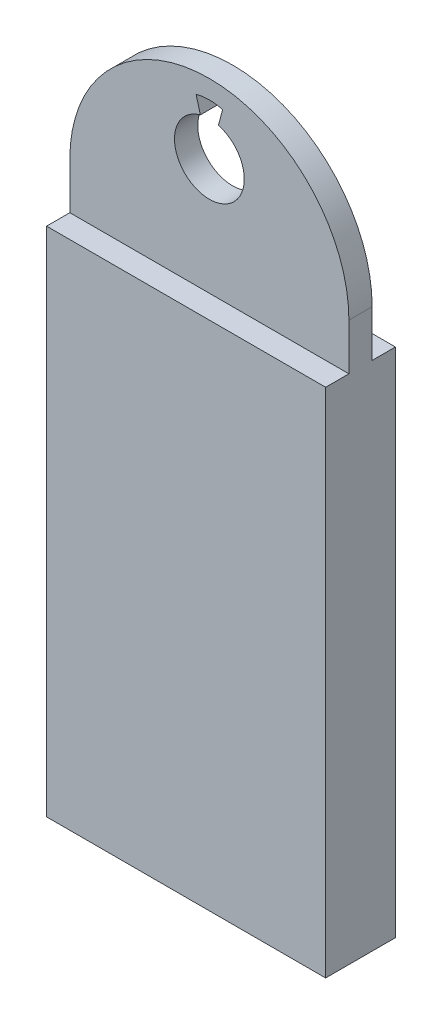
ISO-10303-21;
HEADER;
FILE_DESCRIPTION(('STEP AP214'),'2;1');
FILE_NAME('part.step','',(''),(''),'','','');
FILE_SCHEMA(('AUTOMOTIVE_DESIGN { 1 0 10303 214 1 1 1 1 }'));
ENDSEC;
DATA;
#1=APPLICATION_CONTEXT('core data for automotive mechanical design processes');
#2=APPLICATION_PROTOCOL_DEFINITION('international standard','automotive_design',2000,#1);
#3=PRODUCT_CONTEXT('',#1,'mechanical');
#4=PRODUCT('Part','Part','',(#3));
#5=PRODUCT_RELATED_PRODUCT_CATEGORY('part','',(#4));
#6=PRODUCT_DEFINITION_FORMATION('','',#4);
#7=PRODUCT_DEFINITION_CONTEXT('part definition',#1,'design');
#8=PRODUCT_DEFINITION('design','',#6,#7);
#9=PRODUCT_DEFINITION_SHAPE('','',#8);
#10=(LENGTH_UNIT() NAMED_UNIT(*) SI_UNIT(.MILLI.,.METRE.));
#11=(NAMED_UNIT(*) PLANE_ANGLE_UNIT() SI_UNIT($,.RADIAN.));
#12=(NAMED_UNIT(*) SI_UNIT($,.STERADIAN.) SOLID_ANGLE_UNIT());
#13=UNCERTAINTY_MEASURE_WITH_UNIT(LENGTH_MEASURE(1.E-05),#10,'distance_accuracy_value','');
#14=(GEOMETRIC_REPRESENTATION_CONTEXT(3) GLOBAL_UNCERTAINTY_ASSIGNED_CONTEXT((#13)) GLOBAL_UNIT_ASSIGNED_CONTEXT((#10,
#11,#12)) REPRESENTATION_CONTEXT('',''));
#15=CARTESIAN_POINT('',(0.,0.,0.));
#16=DIRECTION('',(0.,0.,1.));
#17=DIRECTION('',(1.,0.,0.));
#18=AXIS2_PLACEMENT_3D('',#15,#16,#17);
#19=CARTESIAN_POINT('',(-7.96171971814424,0.,30.));
#20=DIRECTION('',(0.,1.,0.));
#21=DIRECTION('',(-1.,0.,0.));
#22=AXIS2_PLACEMENT_3D('',#19,#20,#21);
#23=PLANE('',#22);
#24=DIRECTION('',(1.,0.,0.));
#25=VECTOR('',#24,1.);
#26=CARTESIAN_POINT('',(-7.96171971814424,0.,0.));
#27=LINE('',#26,#25);
#28=CARTESIAN_POINT('',(-127.961719718144,0.,0.));
#29=VERTEX_POINT('',#28);
#30=CARTESIAN_POINT('',(-7.96171971814424,0.,0.));
#31=VERTEX_POINT('',#30);
#32=EDGE_CURVE('E209',#29,#31,#27,.T.);
#33=ORIENTED_EDGE('',*,*,#32,.T.);
#34=DIRECTION('',(0.,0.,-1.));
#35=VECTOR('',#34,1.);
#36=CARTESIAN_POINT('',(-7.96171971814424,0.,30.));
#37=LINE('',#36,#35);
#38=CARTESIAN_POINT('',(-7.96171971814424,0.,30.));
#39=VERTEX_POINT('',#38);
#40=EDGE_CURVE('E11',#39,#31,#37,.T.);
#41=ORIENTED_EDGE('',*,*,#40,.F.);
#42=DIRECTION('',(1.,0.,0.));
#43=VECTOR('',#42,1.);
#44=CARTESIAN_POINT('',(-7.96171971814424,0.,30.));
#45=LINE('',#44,#43);
#46=CARTESIAN_POINT('',(-127.961719718144,0.,30.));
#47=VERTEX_POINT('',#46);
#48=EDGE_CURVE('E233',#47,#39,#45,.T.);
#49=ORIENTED_EDGE('',*,*,#48,.F.);
#50=DIRECTION('',(0.,0.,-1.));
#51=VECTOR('',#50,1.);
#52=CARTESIAN_POINT('',(-127.961719718144,0.,30.));
#53=LINE('',#52,#51);
#54=EDGE_CURVE('E245',#47,#29,#53,.T.);
#55=ORIENTED_EDGE('',*,*,#54,.T.);
#56=EDGE_LOOP('',(#33,#41,#49,#55));
#57=FACE_BOUND('',#56,.T.);
#58=ADVANCED_FACE('F45',(#57),#23,.F.);
#59=CARTESIAN_POINT('',(-7.96171971814427,240.,30.));
#60=DIRECTION('',(-1.,0.,0.));
#61=DIRECTION('',(0.,-1.,0.));
#62=AXIS2_PLACEMENT_3D('',#59,#60,#61);
#63=PLANE('',#62);
#64=DIRECTION('',(0.,0.,-1.));
#65=VECTOR('',#64,1.);
#66=CARTESIAN_POINT('',(-7.96171971814427,220.,0.));
#67=LINE('',#66,#65);
#68=CARTESIAN_POINT('',(-7.96171971814427,220.,10.));
#69=VERTEX_POINT('',#68);
#70=CARTESIAN_POINT('',(-7.96171971814427,220.,0.));
#71=VERTEX_POINT('',#70);
#72=EDGE_CURVE('E198',#69,#71,#67,.T.);
#73=ORIENTED_EDGE('',*,*,#72,.F.);
#74=DIRECTION('',(0.,1.,0.));
#75=VECTOR('',#74,1.);
#76=CARTESIAN_POINT('',(-7.96171971814427,220.,10.));
#77=LINE('',#76,#75);
#78=CARTESIAN_POINT('',(-7.96171971814427,240.,10.));
#79=VERTEX_POINT('',#78);
#80=EDGE_CURVE('E205',#69,#79,#77,.T.);
#81=ORIENTED_EDGE('',*,*,#80,.T.);
#82=DIRECTION('',(0.,0.,-1.));
#83=VECTOR('',#82,1.);
#84=CARTESIAN_POINT('',(-7.96171971814427,240.,30.));
#85=LINE('',#84,#83);
#86=CARTESIAN_POINT('',(-7.96171971814427,240.,20.));
#87=VERTEX_POINT('',#86);
#88=EDGE_CURVE('E53',#87,#79,#85,.T.);
#89=ORIENTED_EDGE('',*,*,#88,.F.);
#90=DIRECTION('',(0.,1.,0.));
#91=VECTOR('',#90,1.);
#92=CARTESIAN_POINT('',(-7.96171971814427,220.,20.));
#93=LINE('',#92,#91);
#94=CARTESIAN_POINT('',(-7.96171971814427,220.,20.));
#95=VERTEX_POINT('',#94);
#96=EDGE_CURVE('E213',#95,#87,#93,.T.);
#97=ORIENTED_EDGE('',*,*,#96,.F.);
#98=DIRECTION('',(0.,0.,-1.));
#99=VECTOR('',#98,1.);
#100=CARTESIAN_POINT('',(-7.96171971814427,220.,20.));
#101=LINE('',#100,#99);
#102=CARTESIAN_POINT('',(-7.96171971814427,220.,30.));
#103=VERTEX_POINT('',#102);
#104=EDGE_CURVE('E227',#103,#95,#101,.T.);
#105=ORIENTED_EDGE('',*,*,#104,.F.);
#106=DIRECTION('',(0.,1.,0.));
#107=VECTOR('',#106,1.);
#108=CARTESIAN_POINT('',(-7.96171971814427,240.,30.));
#109=LINE('',#108,#107);
#110=EDGE_CURVE('E237',#39,#103,#109,.T.);
#111=ORIENTED_EDGE('',*,*,#110,.F.);
#112=ORIENTED_EDGE('',*,*,#40,.T.);
#113=DIRECTION('',(0.,1.,0.));
#114=VECTOR('',#113,1.);
#115=CARTESIAN_POINT('',(-7.96171971814427,240.,0.));
#116=LINE('',#115,#114);
#117=EDGE_CURVE('E249',#31,#71,#116,.T.);
#118=ORIENTED_EDGE('',*,*,#117,.T.);
#119=EDGE_LOOP('',(#73,#81,#89,#97,#105,#111,#112,#118));
#120=FACE_BOUND('',#119,.T.);
#121=ADVANCED_FACE('F273',(#120),#63,.F.);
#122=CARTESIAN_POINT('',(-127.961719718144,0.,30.));
#123=DIRECTION('',(1.,0.,0.));
#124=DIRECTION('',(0.,0.,-1.));
#125=AXIS2_PLACEMENT_3D('',#122,#123,#124);
#126=PLANE('',#125);
#127=DIRECTION('',(0.,0.,-1.));
#128=VECTOR('',#127,1.);
#129=CARTESIAN_POINT('',(-127.961719718144,240.,30.));
#130=LINE('',#129,#128);
#131=CARTESIAN_POINT('',(-127.961719718144,240.,20.));
#132=VERTEX_POINT('',#131);
#133=CARTESIAN_POINT('',(-127.961719718144,240.,10.));
#134=VERTEX_POINT('',#133);
#135=EDGE_CURVE('E258',#132,#134,#130,.T.);
#136=ORIENTED_EDGE('',*,*,#135,.T.);
#137=DIRECTION('',(0.,1.,0.));
#138=VECTOR('',#137,1.);
#139=CARTESIAN_POINT('',(-127.961719718144,220.,10.));
#140=LINE('',#139,#138);
#141=CARTESIAN_POINT('',(-127.961719718144,220.,10.));
#142=VERTEX_POINT('',#141);
#143=EDGE_CURVE('E204',#142,#134,#140,.T.);
#144=ORIENTED_EDGE('',*,*,#143,.F.);
#145=DIRECTION('',(0.,0.,1.));
#146=VECTOR('',#145,1.);
#147=CARTESIAN_POINT('',(-127.961719718144,220.,10.));
#148=LINE('',#147,#146);
#149=CARTESIAN_POINT('',(-127.961719718144,220.,0.));
#150=VERTEX_POINT('',#149);
#151=EDGE_CURVE('E189',#150,#142,#148,.T.);
#152=ORIENTED_EDGE('',*,*,#151,.F.);
#153=DIRECTION('',(0.,-1.,0.));
#154=VECTOR('',#153,1.);
#155=CARTESIAN_POINT('',(-127.961719718144,0.,0.));
#156=LINE('',#155,#154);
#157=EDGE_CURVE('E238',#150,#29,#156,.T.);
#158=ORIENTED_EDGE('',*,*,#157,.T.);
#159=ORIENTED_EDGE('',*,*,#54,.F.);
#160=DIRECTION('',(0.,-1.,0.));
#161=VECTOR('',#160,1.);
#162=CARTESIAN_POINT('',(-127.961719718144,0.,30.));
#163=LINE('',#162,#161);
#164=CARTESIAN_POINT('',(-127.961719718144,220.,30.));
#165=VERTEX_POINT('',#164);
#166=EDGE_CURVE('E242',#165,#47,#163,.T.);
#167=ORIENTED_EDGE('',*,*,#166,.F.);
#168=DIRECTION('',(0.,0.,1.));
#169=VECTOR('',#168,1.);
#170=CARTESIAN_POINT('',(-127.961719718144,220.,30.));
#171=LINE('',#170,#169);
#172=CARTESIAN_POINT('',(-127.961719718144,220.,20.));
#173=VERTEX_POINT('',#172);
#174=EDGE_CURVE('E217',#173,#165,#171,.T.);
#175=ORIENTED_EDGE('',*,*,#174,.F.);
#176=DIRECTION('',(0.,1.,0.));
#177=VECTOR('',#176,1.);
#178=CARTESIAN_POINT('',(-127.961719718144,220.,20.));
#179=LINE('',#178,#177);
#180=EDGE_CURVE('E186',#173,#132,#179,.T.);
#181=ORIENTED_EDGE('',*,*,#180,.T.);
#182=EDGE_LOOP('',(#136,#144,#152,#158,#159,#167,#175,#181));
#183=FACE_BOUND('',#182,.T.);
#184=ADVANCED_FACE('F284',(#183),#126,.F.);
#185=CARTESIAN_POINT('',(0.,0.,30.));
#186=DIRECTION('',(0.,0.,-1.));
#187=DIRECTION('',(-1.,0.,0.));
#188=AXIS2_PLACEMENT_3D('',#185,#186,#187);
#189=PLANE('',#188);
#190=ORIENTED_EDGE('',*,*,#110,.T.);
#191=DIRECTION('',(1.,0.,0.));
#192=VECTOR('',#191,1.);
#193=CARTESIAN_POINT('',(-7.96171971814427,220.,30.));
#194=LINE('',#193,#192);
#195=EDGE_CURVE('E194',#165,#103,#194,.T.);
#196=ORIENTED_EDGE('',*,*,#195,.F.);
#197=ORIENTED_EDGE('',*,*,#166,.T.);
#198=ORIENTED_EDGE('',*,*,#48,.T.);
#199=EDGE_LOOP('',(#190,#196,#197,#198));
#200=FACE_BOUND('',#199,.T.);
#201=ADVANCED_FACE('F290',(#200),#189,.F.);
#202=CARTESIAN_POINT('',(0.,0.,0.));
#203=DIRECTION('',(0.,0.,-1.));
#204=DIRECTION('',(-1.,0.,0.));
#205=AXIS2_PLACEMENT_3D('',#202,#203,#204);
#206=PLANE('',#205);
#207=DIRECTION('',(-1.,0.,0.));
#208=VECTOR('',#207,1.);
#209=CARTESIAN_POINT('',(-127.961719718144,220.,0.));
#210=LINE('',#209,#208);
#211=EDGE_CURVE('E201',#71,#150,#210,.T.);
#212=ORIENTED_EDGE('',*,*,#211,.F.);
#213=ORIENTED_EDGE('',*,*,#117,.F.);
#214=ORIENTED_EDGE('',*,*,#32,.F.);
#215=ORIENTED_EDGE('',*,*,#157,.F.);
#216=EDGE_LOOP('',(#212,#213,#214,#215));
#217=FACE_BOUND('',#216,.T.);
#218=ADVANCED_FACE('F280',(#217),#206,.T.);
#219=CARTESIAN_POINT('',(-7.96171971814427,220.,10.));
#220=DIRECTION('',(0.,0.,1.));
#221=DIRECTION('',(1.,0.,0.));
#222=AXIS2_PLACEMENT_3D('',#219,#220,#221);
#223=PLANE('',#222);
#224=CARTESIAN_POINT('',(-67.9617197181443,270.,10.));
#225=DIRECTION('',(0.,0.,1.));
#226=DIRECTION('',(1.,0.,0.));
#227=AXIS2_PLACEMENT_3D('',#224,#225,#226);
#228=CIRCLE('',#227,15.);
#229=CARTESIAN_POINT('',(-71.8440053946821,284.488887394336,10.));
#230=VERTEX_POINT('',#229);
#231=CARTESIAN_POINT('',(-64.0794340416064,284.488887394336,10.));
#232=VERTEX_POINT('',#231);
#233=EDGE_CURVE('E174',#230,#232,#228,.T.);
#234=ORIENTED_EDGE('',*,*,#233,.T.);
#235=DIRECTION('',(0.258819045102519,0.965925826289069,0.));
#236=VECTOR('',#235,1.);
#237=CARTESIAN_POINT('',(-76.4424818316774,238.349364905389,10.));
#238=LINE('',#237,#236);
#239=CARTESIAN_POINT('',(-62.2677007258888,291.25036817836,10.));
#240=VERTEX_POINT('',#239);
#241=EDGE_CURVE('E178',#232,#240,#238,.T.);
#242=ORIENTED_EDGE('',*,*,#241,.T.);
#243=CARTESIAN_POINT('',(-67.9617197181443,270.,10.));
#244=DIRECTION('',(0.,0.,1.));
#245=DIRECTION('',(1.,0.,0.));
#246=AXIS2_PLACEMENT_3D('',#243,#244,#245);
#247=CIRCLE('',#246,22.);
#248=CARTESIAN_POINT('',(-73.6557387103997,291.25036817836,10.));
#249=VERTEX_POINT('',#248);
#250=EDGE_CURVE('E165',#240,#249,#247,.T.);
#251=ORIENTED_EDGE('',*,*,#250,.T.);
#252=DIRECTION('',(-0.258819045102522,0.965925826289068,0.));
#253=VECTOR('',#252,1.);
#254=CARTESIAN_POINT('',(-51.4424818316773,208.349364905389,10.));
#255=LINE('',#254,#253);
#256=EDGE_CURVE('E140',#230,#249,#255,.T.);
#257=ORIENTED_EDGE('',*,*,#256,.F.);
#258=EDGE_LOOP('',(#234,#242,#251,#257));
#259=FACE_BOUND('',#258,.T.);
#260=ORIENTED_EDGE('',*,*,#143,.T.);
#261=CARTESIAN_POINT('',(-67.9617197181443,240.,10.));
#262=DIRECTION('',(0.,0.,1.));
#263=DIRECTION('',(1.,0.,0.));
#264=AXIS2_PLACEMENT_3D('',#261,#262,#263);
#265=CIRCLE('',#264,60.);
#266=EDGE_CURVE('E183',#79,#134,#265,.T.);
#267=ORIENTED_EDGE('',*,*,#266,.F.);
#268=ORIENTED_EDGE('',*,*,#80,.F.);
#269=DIRECTION('',(1.,0.,0.));
#270=VECTOR('',#269,1.);
#271=CARTESIAN_POINT('',(-7.96171971814427,220.,10.));
#272=LINE('',#271,#270);
#273=EDGE_CURVE('E193',#142,#69,#272,.T.);
#274=ORIENTED_EDGE('',*,*,#273,.F.);
#275=EDGE_LOOP('',(#260,#267,#268,#274));
#276=FACE_BOUND('',#275,.T.);
#277=ADVANCED_FACE('F270',(#259,#276),#223,.F.);
#278=CARTESIAN_POINT('',(0.,220.,0.));
#279=DIRECTION('',(0.,-1.,0.));
#280=DIRECTION('',(0.,0.,-1.));
#281=AXIS2_PLACEMENT_3D('',#278,#279,#280);
#282=PLANE('',#281);
#283=ORIENTED_EDGE('',*,*,#151,.T.);
#284=ORIENTED_EDGE('',*,*,#273,.T.);
#285=ORIENTED_EDGE('',*,*,#72,.T.);
#286=ORIENTED_EDGE('',*,*,#211,.T.);
#287=EDGE_LOOP('',(#283,#284,#285,#286));
#288=FACE_BOUND('',#287,.T.);
#289=ADVANCED_FACE('F276',(#288),#282,.F.);
#290=CARTESIAN_POINT('',(-127.961719718144,220.,20.));
#291=DIRECTION('',(0.,0.,-1.));
#292=DIRECTION('',(-1.,0.,0.));
#293=AXIS2_PLACEMENT_3D('',#290,#291,#292);
#294=PLANE('',#293);
#295=CARTESIAN_POINT('',(-67.9617197181443,270.,20.));
#296=DIRECTION('',(0.,0.,1.));
#297=DIRECTION('',(1.,0.,0.));
#298=AXIS2_PLACEMENT_3D('',#295,#296,#297);
#299=CIRCLE('',#298,22.);
#300=CARTESIAN_POINT('',(-62.2677007258888,291.25036817836,20.));
#301=VERTEX_POINT('',#300);
#302=CARTESIAN_POINT('',(-73.6557387103997,291.25036817836,20.));
#303=VERTEX_POINT('',#302);
#304=EDGE_CURVE('E147',#301,#303,#299,.T.);
#305=ORIENTED_EDGE('',*,*,#304,.F.);
#306=DIRECTION('',(0.258819045102519,0.965925826289069,0.));
#307=VECTOR('',#306,1.);
#308=CARTESIAN_POINT('',(-130.909147739467,35.0770004186366,20.));
#309=LINE('',#308,#307);
#310=CARTESIAN_POINT('',(-64.0794340416064,284.488887394336,20.));
#311=VERTEX_POINT('',#310);
#312=EDGE_CURVE('E68',#311,#301,#309,.T.);
#313=ORIENTED_EDGE('',*,*,#312,.F.);
#314=CARTESIAN_POINT('',(-67.9617197181443,270.,20.));
#315=DIRECTION('',(0.,0.,1.));
#316=DIRECTION('',(1.,0.,0.));
#317=AXIS2_PLACEMENT_3D('',#314,#315,#316);
#318=CIRCLE('',#317,15.);
#319=CARTESIAN_POINT('',(-71.8440053946821,284.488887394336,20.));
#320=VERTEX_POINT('',#319);
#321=EDGE_CURVE('E155',#320,#311,#318,.T.);
#322=ORIENTED_EDGE('',*,*,#321,.F.);
#323=DIRECTION('',(-0.258819045102522,0.965925826289068,0.));
#324=VECTOR('',#323,1.);
#325=CARTESIAN_POINT('',(4.09085226053294,1.09614055956484,20.));
#326=LINE('',#325,#324);
#327=EDGE_CURVE('E137',#320,#303,#326,.T.);
#328=ORIENTED_EDGE('',*,*,#327,.T.);
#329=EDGE_LOOP('',(#305,#313,#322,#328));
#330=FACE_BOUND('',#329,.T.);
#331=ORIENTED_EDGE('',*,*,#96,.T.);
#332=CARTESIAN_POINT('',(-67.9617197181443,240.,20.));
#333=DIRECTION('',(0.,0.,1.));
#334=DIRECTION('',(1.,0.,0.));
#335=AXIS2_PLACEMENT_3D('',#332,#333,#334);
#336=CIRCLE('',#335,60.);
#337=EDGE_CURVE('E182',#87,#132,#336,.T.);
#338=ORIENTED_EDGE('',*,*,#337,.T.);
#339=ORIENTED_EDGE('',*,*,#180,.F.);
#340=DIRECTION('',(-1.,0.,0.));
#341=VECTOR('',#340,1.);
#342=CARTESIAN_POINT('',(-127.961719718144,220.,20.));
#343=LINE('',#342,#341);
#344=EDGE_CURVE('E223',#95,#173,#343,.T.);
#345=ORIENTED_EDGE('',*,*,#344,.F.);
#346=EDGE_LOOP('',(#331,#338,#339,#345));
#347=FACE_BOUND('',#346,.T.);
#348=ADVANCED_FACE('F152',(#330,#347),#294,.F.);
#349=CARTESIAN_POINT('',(0.,220.,0.));
#350=DIRECTION('',(0.,-1.,0.));
#351=DIRECTION('',(0.,0.,-1.));
#352=AXIS2_PLACEMENT_3D('',#349,#350,#351);
#353=PLANE('',#352);
#354=ORIENTED_EDGE('',*,*,#195,.T.);
#355=ORIENTED_EDGE('',*,*,#104,.T.);
#356=ORIENTED_EDGE('',*,*,#344,.T.);
#357=ORIENTED_EDGE('',*,*,#174,.T.);
#358=EDGE_LOOP('',(#354,#355,#356,#357));
#359=FACE_BOUND('',#358,.T.);
#360=ADVANCED_FACE('F294',(#359),#353,.F.);
#361=CARTESIAN_POINT('',(-67.9617197181443,240.,10.));
#362=DIRECTION('',(0.,0.,1.));
#363=DIRECTION('',(1.,0.,0.));
#364=AXIS2_PLACEMENT_3D('',#361,#362,#363);
#365=CYLINDRICAL_SURFACE('',#364,60.);
#366=ORIENTED_EDGE('',*,*,#337,.F.);
#367=ORIENTED_EDGE('',*,*,#88,.T.);
#368=ORIENTED_EDGE('',*,*,#266,.T.);
#369=ORIENTED_EDGE('',*,*,#135,.F.);
#370=EDGE_LOOP('',(#366,#367,#368,#369));
#371=FACE_BOUND('',#370,.T.);
#372=ADVANCED_FACE('F265',(#371),#365,.T.);
#373=CARTESIAN_POINT('',(-130.909147739467,35.0770004186366,0.));
#374=DIRECTION('',(0.965925826289069,-0.258819045102519,0.));
#375=DIRECTION('',(0.258819045102519,0.965925826289069,0.));
#376=AXIS2_PLACEMENT_3D('',#373,#374,#375);
#377=PLANE('',#376);
#378=DIRECTION('',(0.,0.,1.));
#379=VECTOR('',#378,1.);
#380=CARTESIAN_POINT('',(-64.0794340416064,284.488887394336,0.));
#381=LINE('',#380,#379);
#382=EDGE_CURVE('E162',#232,#311,#381,.T.);
#383=ORIENTED_EDGE('',*,*,#382,.T.);
#384=ORIENTED_EDGE('',*,*,#312,.T.);
#385=DIRECTION('',(0.,0.,1.));
#386=VECTOR('',#385,1.);
#387=CARTESIAN_POINT('',(-62.2677007258888,291.25036817836,0.));
#388=LINE('',#387,#386);
#389=EDGE_CURVE('E144',#240,#301,#388,.T.);
#390=ORIENTED_EDGE('',*,*,#389,.F.);
#391=ORIENTED_EDGE('',*,*,#241,.F.);
#392=EDGE_LOOP('',(#383,#384,#390,#391));
#393=FACE_BOUND('',#392,.T.);
#394=ADVANCED_FACE('F364',(#393),#377,.F.);
#395=CARTESIAN_POINT('',(-67.9617197181443,270.,0.));
#396=DIRECTION('',(0.,0.,1.));
#397=DIRECTION('',(1.,0.,0.));
#398=AXIS2_PLACEMENT_3D('',#395,#396,#397);
#399=CYLINDRICAL_SURFACE('',#398,15.);
#400=DIRECTION('',(0.,0.,1.));
#401=VECTOR('',#400,1.);
#402=CARTESIAN_POINT('',(-71.8440053946821,284.488887394336,0.));
#403=LINE('',#402,#401);
#404=EDGE_CURVE('E143',#230,#320,#403,.T.);
#405=ORIENTED_EDGE('',*,*,#404,.T.);
#406=ORIENTED_EDGE('',*,*,#321,.T.);
#407=ORIENTED_EDGE('',*,*,#382,.F.);
#408=ORIENTED_EDGE('',*,*,#233,.F.);
#409=EDGE_LOOP('',(#405,#406,#407,#408));
#410=FACE_BOUND('',#409,.T.);
#411=ADVANCED_FACE('F376',(#410),#399,.F.);
#412=CARTESIAN_POINT('',(4.09085226053294,1.09614055956484,0.));
#413=DIRECTION('',(0.965925826289068,0.258819045102522,0.));
#414=DIRECTION('',(-0.258819045102522,0.965925826289068,0.));
#415=AXIS2_PLACEMENT_3D('',#412,#413,#414);
#416=PLANE('',#415);
#417=ORIENTED_EDGE('',*,*,#256,.T.);
#418=DIRECTION('',(0.,0.,1.));
#419=VECTOR('',#418,1.);
#420=CARTESIAN_POINT('',(-73.6557387103997,291.25036817836,0.));
#421=LINE('',#420,#419);
#422=EDGE_CURVE('E60',#249,#303,#421,.T.);
#423=ORIENTED_EDGE('',*,*,#422,.T.);
#424=ORIENTED_EDGE('',*,*,#327,.F.);
#425=ORIENTED_EDGE('',*,*,#404,.F.);
#426=EDGE_LOOP('',(#417,#423,#424,#425));
#427=FACE_BOUND('',#426,.T.);
#428=ADVANCED_FACE('F134',(#427),#416,.T.);
#429=CARTESIAN_POINT('',(-67.9617197181443,270.,0.));
#430=DIRECTION('',(0.,0.,1.));
#431=DIRECTION('',(1.,0.,0.));
#432=AXIS2_PLACEMENT_3D('',#429,#430,#431);
#433=CYLINDRICAL_SURFACE('',#432,22.);
#434=ORIENTED_EDGE('',*,*,#389,.T.);
#435=ORIENTED_EDGE('',*,*,#304,.T.);
#436=ORIENTED_EDGE('',*,*,#422,.F.);
#437=ORIENTED_EDGE('',*,*,#250,.F.);
#438=EDGE_LOOP('',(#434,#435,#436,#437));
#439=FACE_BOUND('',#438,.T.);
#440=ADVANCED_FACE('F148',(#439),#433,.F.);
#441=CLOSED_SHELL('',(#58,#121,#184,#201,#218,#277,#289,#348,#360,#372,#394,#411,#428,#440));
#442=MANIFOLD_SOLID_BREP('B2',#441);
#443=ADVANCED_BREP_SHAPE_REPRESENTATION('',(#18,#442),#14);
#444=SHAPE_DEFINITION_REPRESENTATION(#9,#443);
ENDSEC;
END-ISO-10303-21;
